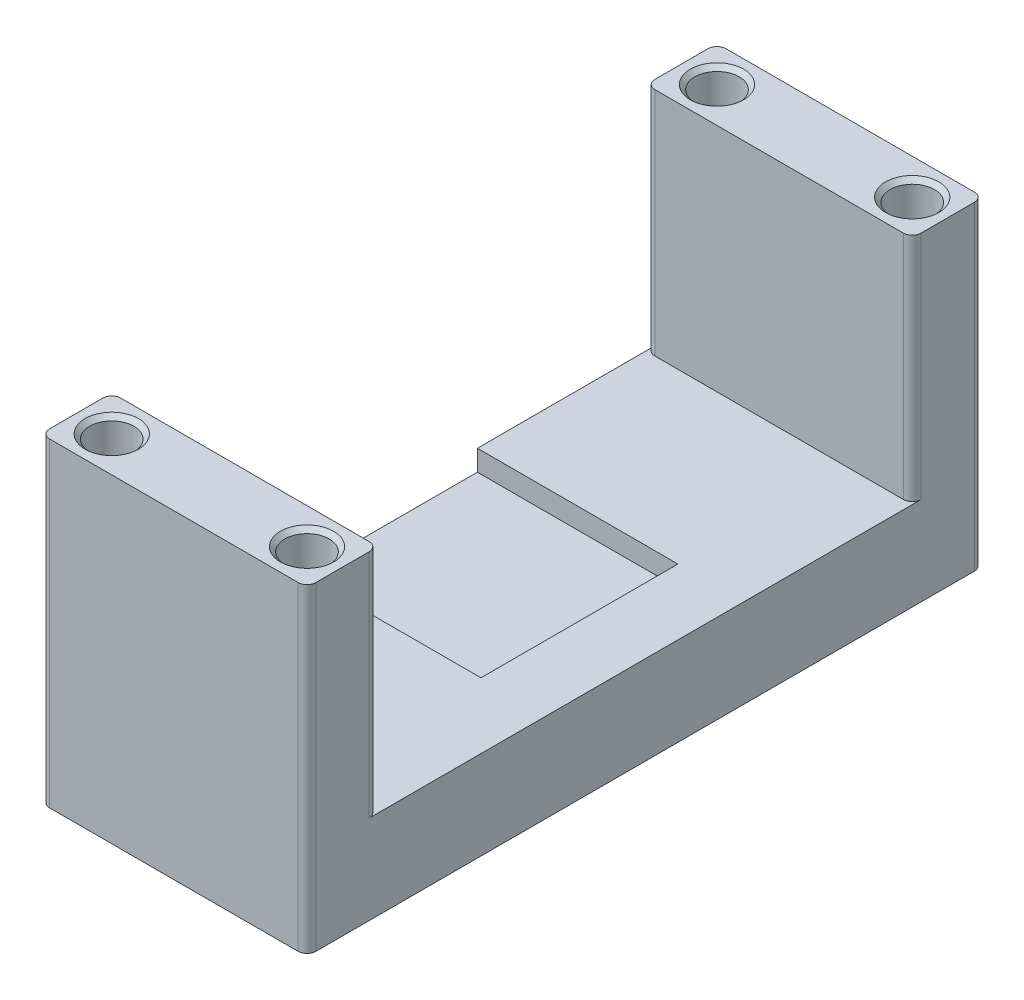
ISO-10303-21;
HEADER;
FILE_DESCRIPTION(('STEP AP214'),'2;1');
FILE_NAME('part.step','',(''),(''),'','','');
FILE_SCHEMA(('AUTOMOTIVE_DESIGN { 1 0 10303 214 1 1 1 1 }'));
ENDSEC;
DATA;
#1=APPLICATION_CONTEXT('core data for automotive mechanical design processes');
#2=APPLICATION_PROTOCOL_DEFINITION('international standard','automotive_design',2000,#1);
#3=PRODUCT_CONTEXT('',#1,'mechanical');
#4=PRODUCT('Part','Part','',(#3));
#5=PRODUCT_RELATED_PRODUCT_CATEGORY('part','',(#4));
#6=PRODUCT_DEFINITION_FORMATION('','',#4);
#7=PRODUCT_DEFINITION_CONTEXT('part definition',#1,'design');
#8=PRODUCT_DEFINITION('design','',#6,#7);
#9=PRODUCT_DEFINITION_SHAPE('','',#8);
#10=(LENGTH_UNIT() NAMED_UNIT(*) SI_UNIT(.MILLI.,.METRE.));
#11=(NAMED_UNIT(*) PLANE_ANGLE_UNIT() SI_UNIT($,.RADIAN.));
#12=(NAMED_UNIT(*) SI_UNIT($,.STERADIAN.) SOLID_ANGLE_UNIT());
#13=UNCERTAINTY_MEASURE_WITH_UNIT(LENGTH_MEASURE(1.E-05),#10,'distance_accuracy_value','');
#14=(GEOMETRIC_REPRESENTATION_CONTEXT(3) GLOBAL_UNCERTAINTY_ASSIGNED_CONTEXT((#13)) GLOBAL_UNIT_ASSIGNED_CONTEXT((#10,
#11,#12)) REPRESENTATION_CONTEXT('',''));
#15=CARTESIAN_POINT('',(0.,0.,0.));
#16=DIRECTION('',(0.,0.,1.));
#17=DIRECTION('',(1.,0.,0.));
#18=AXIS2_PLACEMENT_3D('',#15,#16,#17);
#19=CARTESIAN_POINT('',(0.,0.,0.));
#20=DIRECTION('',(0.,1.,0.));
#21=DIRECTION('',(0.,0.,1.));
#22=AXIS2_PLACEMENT_3D('',#19,#20,#21);
#23=PLANE('',#22);
#24=DIRECTION('',(0.,0.,1.));
#25=VECTOR('',#24,1.);
#26=CARTESIAN_POINT('',(-15.,0.,-38.1));
#27=LINE('',#26,#25);
#28=CARTESIAN_POINT('',(-15.,0.,11.1));
#29=VERTEX_POINT('',#28);
#30=CARTESIAN_POINT('',(-15.,0.,31.1));
#31=VERTEX_POINT('',#30);
#32=EDGE_CURVE('E196',#29,#31,#27,.T.);
#33=ORIENTED_EDGE('',*,*,#32,.T.);
#34=CARTESIAN_POINT('',(-14.,0.,31.1));
#35=DIRECTION('',(0.,1.,0.));
#36=DIRECTION('',(0.,0.,1.));
#37=AXIS2_PLACEMENT_3D('',#34,#35,#36);
#38=CIRCLE('',#37,1.);
#39=CARTESIAN_POINT('',(-14.,0.,30.1));
#40=VERTEX_POINT('',#39);
#41=EDGE_CURVE('E281',#31,#40,#38,.F.);
#42=ORIENTED_EDGE('',*,*,#41,.T.);
#43=DIRECTION('',(-1.,0.,0.));
#44=VECTOR('',#43,1.);
#45=CARTESIAN_POINT('',(-15.,0.,30.1));
#46=LINE('',#45,#44);
#47=CARTESIAN_POINT('',(14.,0.,30.1));
#48=VERTEX_POINT('',#47);
#49=EDGE_CURVE('E288',#48,#40,#46,.T.);
#50=ORIENTED_EDGE('',*,*,#49,.F.);
#51=CARTESIAN_POINT('',(14.,0.,31.1));
#52=DIRECTION('',(0.,1.,0.));
#53=DIRECTION('',(0.,0.,1.));
#54=AXIS2_PLACEMENT_3D('',#51,#52,#53);
#55=CIRCLE('',#54,1.);
#56=CARTESIAN_POINT('',(15.,0.,31.1));
#57=VERTEX_POINT('',#56);
#58=EDGE_CURVE('E283',#48,#57,#55,.F.);
#59=ORIENTED_EDGE('',*,*,#58,.T.);
#60=DIRECTION('',(0.,0.,-1.));
#61=VECTOR('',#60,1.);
#62=CARTESIAN_POINT('',(15.,0.,-38.1));
#63=LINE('',#62,#61);
#64=CARTESIAN_POINT('',(15.,0.,-31.1));
#65=VERTEX_POINT('',#64);
#66=EDGE_CURVE('E207',#57,#65,#63,.T.);
#67=ORIENTED_EDGE('',*,*,#66,.T.);
#68=CARTESIAN_POINT('',(14.,0.,-31.1));
#69=DIRECTION('',(0.,1.,0.));
#70=DIRECTION('',(0.,0.,1.));
#71=AXIS2_PLACEMENT_3D('',#68,#69,#70);
#72=CIRCLE('',#71,1.);
#73=CARTESIAN_POINT('',(14.,0.,-30.1));
#74=VERTEX_POINT('',#73);
#75=EDGE_CURVE('E41',#65,#74,#72,.F.);
#76=ORIENTED_EDGE('',*,*,#75,.T.);
#77=DIRECTION('',(1.,0.,0.));
#78=VECTOR('',#77,1.);
#79=CARTESIAN_POINT('',(-15.,0.,-30.1));
#80=LINE('',#79,#78);
#81=CARTESIAN_POINT('',(-14.,0.,-30.1));
#82=VERTEX_POINT('',#81);
#83=EDGE_CURVE('E307',#82,#74,#80,.T.);
#84=ORIENTED_EDGE('',*,*,#83,.F.);
#85=CARTESIAN_POINT('',(-14.,0.,-31.1));
#86=DIRECTION('',(0.,1.,0.));
#87=DIRECTION('',(0.,0.,1.));
#88=AXIS2_PLACEMENT_3D('',#85,#86,#87);
#89=CIRCLE('',#88,1.);
#90=CARTESIAN_POINT('',(-15.,0.,-31.1));
#91=VERTEX_POINT('',#90);
#92=EDGE_CURVE('E11',#82,#91,#89,.F.);
#93=ORIENTED_EDGE('',*,*,#92,.T.);
#94=CARTESIAN_POINT('',(-15.,0.,-11.1));
#95=VERTEX_POINT('',#94);
#96=EDGE_CURVE('E217',#91,#95,#27,.T.);
#97=ORIENTED_EDGE('',*,*,#96,.T.);
#98=DIRECTION('',(-1.,0.,0.));
#99=VECTOR('',#98,1.);
#100=CARTESIAN_POINT('',(-15.,0.,-11.1));
#101=LINE('',#100,#99);
#102=CARTESIAN_POINT('',(7.6,0.,-11.1));
#103=VERTEX_POINT('',#102);
#104=EDGE_CURVE('E190',#103,#95,#101,.T.);
#105=ORIENTED_EDGE('',*,*,#104,.F.);
#106=DIRECTION('',(0.,0.,-1.));
#107=VECTOR('',#106,1.);
#108=CARTESIAN_POINT('',(7.6,0.,-11.1));
#109=LINE('',#108,#107);
#110=CARTESIAN_POINT('',(7.6,0.,11.1));
#111=VERTEX_POINT('',#110);
#112=EDGE_CURVE('E331',#111,#103,#109,.T.);
#113=ORIENTED_EDGE('',*,*,#112,.F.);
#114=DIRECTION('',(1.,0.,0.));
#115=VECTOR('',#114,1.);
#116=CARTESIAN_POINT('',(-15.,0.,11.1));
#117=LINE('',#116,#115);
#118=EDGE_CURVE('E327',#29,#111,#117,.T.);
#119=ORIENTED_EDGE('',*,*,#118,.F.);
#120=EDGE_LOOP('',(#33,#42,#50,#59,#67,#76,#84,#93,#97,#105,#113,#119));
#121=FACE_BOUND('',#120,.T.);
#122=ADVANCED_FACE('F33',(#121),#23,.T.);
#123=CARTESIAN_POINT('',(-15.,-10.,-38.1));
#124=DIRECTION('',(-1.,0.,0.));
#125=DIRECTION('',(0.,0.,1.));
#126=AXIS2_PLACEMENT_3D('',#123,#124,#125);
#127=PLANE('',#126);
#128=DIRECTION('',(0.,0.,1.));
#129=VECTOR('',#128,1.);
#130=CARTESIAN_POINT('',(-15.,26.,38.1));
#131=LINE('',#130,#129);
#132=CARTESIAN_POINT('',(-15.,26.,31.1));
#133=VERTEX_POINT('',#132);
#134=CARTESIAN_POINT('',(-15.,26.,37.1));
#135=VERTEX_POINT('',#134);
#136=EDGE_CURVE('E309',#133,#135,#131,.T.);
#137=ORIENTED_EDGE('',*,*,#136,.F.);
#138=DIRECTION('',(0.,-1.,0.));
#139=VECTOR('',#138,1.);
#140=CARTESIAN_POINT('',(-15.,0.,31.1));
#141=LINE('',#140,#139);
#142=EDGE_CURVE('E226',#133,#31,#141,.T.);
#143=ORIENTED_EDGE('',*,*,#142,.T.);
#144=ORIENTED_EDGE('',*,*,#32,.F.);
#145=DIRECTION('',(0.,1.,0.));
#146=VECTOR('',#145,1.);
#147=CARTESIAN_POINT('',(-15.,-2.335,11.1));
#148=LINE('',#147,#146);
#149=CARTESIAN_POINT('',(-15.,-2.335,11.1));
#150=VERTEX_POINT('',#149);
#151=EDGE_CURVE('E174',#150,#29,#148,.T.);
#152=ORIENTED_EDGE('',*,*,#151,.F.);
#153=DIRECTION('',(0.,0.,1.));
#154=VECTOR('',#153,1.);
#155=CARTESIAN_POINT('',(-15.,-2.335,-11.1));
#156=LINE('',#155,#154);
#157=CARTESIAN_POINT('',(-15.,-2.335,-11.1));
#158=VERTEX_POINT('',#157);
#159=EDGE_CURVE('E181',#158,#150,#156,.T.);
#160=ORIENTED_EDGE('',*,*,#159,.F.);
#161=DIRECTION('',(0.,1.,0.));
#162=VECTOR('',#161,1.);
#163=CARTESIAN_POINT('',(-15.,-2.335,-11.1));
#164=LINE('',#163,#162);
#165=EDGE_CURVE('E336',#158,#95,#164,.T.);
#166=ORIENTED_EDGE('',*,*,#165,.T.);
#167=ORIENTED_EDGE('',*,*,#96,.F.);
#168=DIRECTION('',(0.,-1.,0.));
#169=VECTOR('',#168,1.);
#170=CARTESIAN_POINT('',(-15.,26.,-31.1));
#171=LINE('',#170,#169);
#172=CARTESIAN_POINT('',(-15.,26.,-31.1));
#173=VERTEX_POINT('',#172);
#174=EDGE_CURVE('E221',#91,#173,#171,.F.);
#175=ORIENTED_EDGE('',*,*,#174,.T.);
#176=DIRECTION('',(0.,0.,1.));
#177=VECTOR('',#176,1.);
#178=CARTESIAN_POINT('',(-15.,26.,-38.1));
#179=LINE('',#178,#177);
#180=CARTESIAN_POINT('',(-15.,26.,-37.1));
#181=VERTEX_POINT('',#180);
#182=EDGE_CURVE('E315',#181,#173,#179,.T.);
#183=ORIENTED_EDGE('',*,*,#182,.F.);
#184=DIRECTION('',(0.,1.,0.));
#185=VECTOR('',#184,1.);
#186=CARTESIAN_POINT('',(-15.,-10.,-37.1));
#187=LINE('',#186,#185);
#188=CARTESIAN_POINT('',(-15.,-10.,-37.1));
#189=VERTEX_POINT('',#188);
#190=EDGE_CURVE('E216',#181,#189,#187,.F.);
#191=ORIENTED_EDGE('',*,*,#190,.T.);
#192=DIRECTION('',(0.,0.,1.));
#193=VECTOR('',#192,1.);
#194=CARTESIAN_POINT('',(-15.,-10.,-38.1));
#195=LINE('',#194,#193);
#196=CARTESIAN_POINT('',(-15.,-10.,37.1));
#197=VERTEX_POINT('',#196);
#198=EDGE_CURVE('E203',#189,#197,#195,.T.);
#199=ORIENTED_EDGE('',*,*,#198,.T.);
#200=DIRECTION('',(0.,1.,0.));
#201=VECTOR('',#200,1.);
#202=CARTESIAN_POINT('',(-15.,-10.,37.1));
#203=LINE('',#202,#201);
#204=EDGE_CURVE('E223',#197,#135,#203,.T.);
#205=ORIENTED_EDGE('',*,*,#204,.T.);
#206=EDGE_LOOP('',(#137,#143,#144,#152,#160,#166,#167,#175,#183,#191,#199,#205));
#207=FACE_BOUND('',#206,.T.);
#208=ADVANCED_FACE('F194',(#207),#127,.T.);
#209=CARTESIAN_POINT('',(-15.,-10.,-38.1));
#210=DIRECTION('',(0.,0.,-1.));
#211=DIRECTION('',(-1.,0.,0.));
#212=AXIS2_PLACEMENT_3D('',#209,#210,#211);
#213=PLANE('',#212);
#214=DIRECTION('',(-1.,0.,0.));
#215=VECTOR('',#214,1.);
#216=CARTESIAN_POINT('',(-15.,26.,-38.1));
#217=LINE('',#216,#215);
#218=CARTESIAN_POINT('',(14.,26.,-38.1));
#219=VERTEX_POINT('',#218);
#220=CARTESIAN_POINT('',(-14.,26.,-38.1));
#221=VERTEX_POINT('',#220);
#222=EDGE_CURVE('E324',#219,#221,#217,.T.);
#223=ORIENTED_EDGE('',*,*,#222,.F.);
#224=DIRECTION('',(0.,1.,0.));
#225=VECTOR('',#224,1.);
#226=CARTESIAN_POINT('',(14.,-10.,-38.1));
#227=LINE('',#226,#225);
#228=CARTESIAN_POINT('',(14.,-10.,-38.1));
#229=VERTEX_POINT('',#228);
#230=EDGE_CURVE('E275',#219,#229,#227,.F.);
#231=ORIENTED_EDGE('',*,*,#230,.T.);
#232=DIRECTION('',(-1.,0.,0.));
#233=VECTOR('',#232,1.);
#234=CARTESIAN_POINT('',(-15.,-10.,-38.1));
#235=LINE('',#234,#233);
#236=CARTESIAN_POINT('',(-14.,-10.,-38.1));
#237=VERTEX_POINT('',#236);
#238=EDGE_CURVE('E213',#229,#237,#235,.T.);
#239=ORIENTED_EDGE('',*,*,#238,.T.);
#240=DIRECTION('',(0.,1.,0.));
#241=VECTOR('',#240,1.);
#242=CARTESIAN_POINT('',(-14.,-10.,-38.1));
#243=LINE('',#242,#241);
#244=EDGE_CURVE('E272',#237,#221,#243,.T.);
#245=ORIENTED_EDGE('',*,*,#244,.T.);
#246=EDGE_LOOP('',(#223,#231,#239,#245));
#247=FACE_BOUND('',#246,.T.);
#248=ADVANCED_FACE('F363',(#247),#213,.T.);
#249=CARTESIAN_POINT('',(15.,-10.,-38.1));
#250=DIRECTION('',(1.,0.,0.));
#251=DIRECTION('',(0.,0.,-1.));
#252=AXIS2_PLACEMENT_3D('',#249,#250,#251);
#253=PLANE('',#252);
#254=ORIENTED_EDGE('',*,*,#66,.F.);
#255=DIRECTION('',(0.,-1.,0.));
#256=VECTOR('',#255,1.);
#257=CARTESIAN_POINT('',(15.,26.,31.1));
#258=LINE('',#257,#256);
#259=CARTESIAN_POINT('',(15.,26.,31.1));
#260=VERTEX_POINT('',#259);
#261=EDGE_CURVE('E249',#57,#260,#258,.F.);
#262=ORIENTED_EDGE('',*,*,#261,.T.);
#263=DIRECTION('',(0.,0.,-1.));
#264=VECTOR('',#263,1.);
#265=CARTESIAN_POINT('',(15.,26.,38.1));
#266=LINE('',#265,#264);
#267=CARTESIAN_POINT('',(15.,26.,37.1));
#268=VERTEX_POINT('',#267);
#269=EDGE_CURVE('E297',#268,#260,#266,.T.);
#270=ORIENTED_EDGE('',*,*,#269,.F.);
#271=DIRECTION('',(0.,1.,0.));
#272=VECTOR('',#271,1.);
#273=CARTESIAN_POINT('',(15.,-10.,37.1));
#274=LINE('',#273,#272);
#275=CARTESIAN_POINT('',(15.,-10.,37.1));
#276=VERTEX_POINT('',#275);
#277=EDGE_CURVE('E247',#268,#276,#274,.F.);
#278=ORIENTED_EDGE('',*,*,#277,.T.);
#279=DIRECTION('',(0.,0.,-1.));
#280=VECTOR('',#279,1.);
#281=CARTESIAN_POINT('',(15.,-10.,-38.1));
#282=LINE('',#281,#280);
#283=CARTESIAN_POINT('',(15.,-10.,-37.1));
#284=VERTEX_POINT('',#283);
#285=EDGE_CURVE('E210',#276,#284,#282,.T.);
#286=ORIENTED_EDGE('',*,*,#285,.T.);
#287=DIRECTION('',(0.,1.,0.));
#288=VECTOR('',#287,1.);
#289=CARTESIAN_POINT('',(15.,-10.,-37.1));
#290=LINE('',#289,#288);
#291=CARTESIAN_POINT('',(15.,26.,-37.1));
#292=VERTEX_POINT('',#291);
#293=EDGE_CURVE('E244',#284,#292,#290,.T.);
#294=ORIENTED_EDGE('',*,*,#293,.T.);
#295=DIRECTION('',(0.,0.,-1.));
#296=VECTOR('',#295,1.);
#297=CARTESIAN_POINT('',(15.,26.,-38.1));
#298=LINE('',#297,#296);
#299=CARTESIAN_POINT('',(15.,26.,-31.1));
#300=VERTEX_POINT('',#299);
#301=EDGE_CURVE('E321',#300,#292,#298,.T.);
#302=ORIENTED_EDGE('',*,*,#301,.F.);
#303=DIRECTION('',(0.,-1.,0.));
#304=VECTOR('',#303,1.);
#305=CARTESIAN_POINT('',(15.,0.,-31.1));
#306=LINE('',#305,#304);
#307=EDGE_CURVE('E241',#300,#65,#306,.T.);
#308=ORIENTED_EDGE('',*,*,#307,.T.);
#309=EDGE_LOOP('',(#254,#262,#270,#278,#286,#294,#302,#308));
#310=FACE_BOUND('',#309,.T.);
#311=ADVANCED_FACE('F296',(#310),#253,.T.);
#312=CARTESIAN_POINT('',(-15.,-10.,38.1));
#313=DIRECTION('',(0.,0.,1.));
#314=DIRECTION('',(1.,0.,0.));
#315=AXIS2_PLACEMENT_3D('',#312,#313,#314);
#316=PLANE('',#315);
#317=DIRECTION('',(1.,0.,0.));
#318=VECTOR('',#317,1.);
#319=CARTESIAN_POINT('',(-15.,-10.,38.1));
#320=LINE('',#319,#318);
#321=CARTESIAN_POINT('',(-14.,-10.,38.1));
#322=VERTEX_POINT('',#321);
#323=CARTESIAN_POINT('',(14.,-10.,38.1));
#324=VERTEX_POINT('',#323);
#325=EDGE_CURVE('E206',#322,#324,#320,.T.);
#326=ORIENTED_EDGE('',*,*,#325,.T.);
#327=DIRECTION('',(0.,1.,0.));
#328=VECTOR('',#327,1.);
#329=CARTESIAN_POINT('',(14.,-10.,38.1));
#330=LINE('',#329,#328);
#331=CARTESIAN_POINT('',(14.,26.,38.1));
#332=VERTEX_POINT('',#331);
#333=EDGE_CURVE('E253',#324,#332,#330,.T.);
#334=ORIENTED_EDGE('',*,*,#333,.T.);
#335=DIRECTION('',(1.,0.,0.));
#336=VECTOR('',#335,1.);
#337=CARTESIAN_POINT('',(-15.,26.,38.1));
#338=LINE('',#337,#336);
#339=CARTESIAN_POINT('',(-14.,26.,38.1));
#340=VERTEX_POINT('',#339);
#341=EDGE_CURVE('E305',#340,#332,#338,.T.);
#342=ORIENTED_EDGE('',*,*,#341,.F.);
#343=DIRECTION('',(0.,1.,0.));
#344=VECTOR('',#343,1.);
#345=CARTESIAN_POINT('',(-14.,-10.,38.1));
#346=LINE('',#345,#344);
#347=EDGE_CURVE('E251',#340,#322,#346,.F.);
#348=ORIENTED_EDGE('',*,*,#347,.T.);
#349=EDGE_LOOP('',(#326,#334,#342,#348));
#350=FACE_BOUND('',#349,.T.);
#351=ADVANCED_FACE('F378',(#350),#316,.T.);
#352=CARTESIAN_POINT('',(0.,-10.,0.));
#353=DIRECTION('',(0.,1.,0.));
#354=DIRECTION('',(0.,0.,1.));
#355=AXIS2_PLACEMENT_3D('',#352,#353,#354);
#356=PLANE('',#355);
#357=ORIENTED_EDGE('',*,*,#285,.F.);
#358=CARTESIAN_POINT('',(14.,-10.,37.1));
#359=DIRECTION('',(0.,1.,0.));
#360=DIRECTION('',(0.,0.,1.));
#361=AXIS2_PLACEMENT_3D('',#358,#359,#360);
#362=CIRCLE('',#361,1.);
#363=EDGE_CURVE('E262',#276,#324,#362,.F.);
#364=ORIENTED_EDGE('',*,*,#363,.T.);
#365=ORIENTED_EDGE('',*,*,#325,.F.);
#366=CARTESIAN_POINT('',(-14.,-10.,37.1));
#367=DIRECTION('',(0.,1.,0.));
#368=DIRECTION('',(0.,0.,1.));
#369=AXIS2_PLACEMENT_3D('',#366,#367,#368);
#370=CIRCLE('',#369,1.);
#371=EDGE_CURVE('E260',#322,#197,#370,.F.);
#372=ORIENTED_EDGE('',*,*,#371,.T.);
#373=ORIENTED_EDGE('',*,*,#198,.F.);
#374=CARTESIAN_POINT('',(-14.,-10.,-37.1));
#375=DIRECTION('',(0.,1.,0.));
#376=DIRECTION('',(0.,0.,1.));
#377=AXIS2_PLACEMENT_3D('',#374,#375,#376);
#378=CIRCLE('',#377,1.);
#379=EDGE_CURVE('E256',#189,#237,#378,.F.);
#380=ORIENTED_EDGE('',*,*,#379,.T.);
#381=ORIENTED_EDGE('',*,*,#238,.F.);
#382=CARTESIAN_POINT('',(14.,-10.,-37.1));
#383=DIRECTION('',(0.,1.,0.));
#384=DIRECTION('',(0.,0.,1.));
#385=AXIS2_PLACEMENT_3D('',#382,#383,#384);
#386=CIRCLE('',#385,1.);
#387=EDGE_CURVE('E258',#229,#284,#386,.F.);
#388=ORIENTED_EDGE('',*,*,#387,.T.);
#389=EDGE_LOOP('',(#357,#364,#365,#372,#373,#380,#381,#388));
#390=FACE_BOUND('',#389,.T.);
#391=ADVANCED_FACE('F370',(#390),#356,.F.);
#392=CARTESIAN_POINT('',(-15.,-2.335,-11.1));
#393=DIRECTION('',(0.,0.,-1.));
#394=DIRECTION('',(-1.,0.,0.));
#395=AXIS2_PLACEMENT_3D('',#392,#393,#394);
#396=PLANE('',#395);
#397=ORIENTED_EDGE('',*,*,#104,.T.);
#398=ORIENTED_EDGE('',*,*,#165,.F.);
#399=DIRECTION('',(-1.,0.,0.));
#400=VECTOR('',#399,1.);
#401=CARTESIAN_POINT('',(-15.,-2.335,-11.1));
#402=LINE('',#401,#400);
#403=CARTESIAN_POINT('',(7.6,-2.335,-11.1));
#404=VERTEX_POINT('',#403);
#405=EDGE_CURVE('E187',#404,#158,#402,.T.);
#406=ORIENTED_EDGE('',*,*,#405,.F.);
#407=DIRECTION('',(0.,1.,0.));
#408=VECTOR('',#407,1.);
#409=CARTESIAN_POINT('',(7.6,-2.335,-11.1));
#410=LINE('',#409,#408);
#411=EDGE_CURVE('E198',#404,#103,#410,.T.);
#412=ORIENTED_EDGE('',*,*,#411,.T.);
#413=EDGE_LOOP('',(#397,#398,#406,#412));
#414=FACE_BOUND('',#413,.T.);
#415=ADVANCED_FACE('F338',(#414),#396,.F.);
#416=CARTESIAN_POINT('',(7.6,-2.335,-11.1));
#417=DIRECTION('',(1.,0.,0.));
#418=DIRECTION('',(0.,0.,-1.));
#419=AXIS2_PLACEMENT_3D('',#416,#417,#418);
#420=PLANE('',#419);
#421=ORIENTED_EDGE('',*,*,#112,.T.);
#422=ORIENTED_EDGE('',*,*,#411,.F.);
#423=DIRECTION('',(0.,0.,-1.));
#424=VECTOR('',#423,1.);
#425=CARTESIAN_POINT('',(7.6,-2.335,-11.1));
#426=LINE('',#425,#424);
#427=CARTESIAN_POINT('',(7.6,-2.335,11.1));
#428=VERTEX_POINT('',#427);
#429=EDGE_CURVE('E180',#428,#404,#426,.T.);
#430=ORIENTED_EDGE('',*,*,#429,.F.);
#431=DIRECTION('',(0.,1.,0.));
#432=VECTOR('',#431,1.);
#433=CARTESIAN_POINT('',(7.6,-2.335,11.1));
#434=LINE('',#433,#432);
#435=EDGE_CURVE('E176',#428,#111,#434,.T.);
#436=ORIENTED_EDGE('',*,*,#435,.T.);
#437=EDGE_LOOP('',(#421,#422,#430,#436));
#438=FACE_BOUND('',#437,.T.);
#439=ADVANCED_FACE('F342',(#438),#420,.F.);
#440=CARTESIAN_POINT('',(-15.,-2.335,11.1));
#441=DIRECTION('',(0.,0.,1.));
#442=DIRECTION('',(1.,0.,0.));
#443=AXIS2_PLACEMENT_3D('',#440,#441,#442);
#444=PLANE('',#443);
#445=ORIENTED_EDGE('',*,*,#118,.T.);
#446=ORIENTED_EDGE('',*,*,#435,.F.);
#447=DIRECTION('',(1.,0.,0.));
#448=VECTOR('',#447,1.);
#449=CARTESIAN_POINT('',(-15.,-2.335,11.1));
#450=LINE('',#449,#448);
#451=EDGE_CURVE('E169',#150,#428,#450,.T.);
#452=ORIENTED_EDGE('',*,*,#451,.F.);
#453=ORIENTED_EDGE('',*,*,#151,.T.);
#454=EDGE_LOOP('',(#445,#446,#452,#453));
#455=FACE_BOUND('',#454,.T.);
#456=ADVANCED_FACE('F172',(#455),#444,.F.);
#457=CARTESIAN_POINT('',(0.,-2.335,0.));
#458=DIRECTION('',(0.,1.,0.));
#459=DIRECTION('',(0.,0.,1.));
#460=AXIS2_PLACEMENT_3D('',#457,#458,#459);
#461=PLANE('',#460);
#462=ORIENTED_EDGE('',*,*,#159,.T.);
#463=ORIENTED_EDGE('',*,*,#451,.T.);
#464=ORIENTED_EDGE('',*,*,#429,.T.);
#465=ORIENTED_EDGE('',*,*,#405,.T.);
#466=EDGE_LOOP('',(#462,#463,#464,#465));
#467=FACE_BOUND('',#466,.T.);
#468=ADVANCED_FACE('F185',(#467),#461,.T.);
#469=CARTESIAN_POINT('',(-15.,26.,-30.1));
#470=DIRECTION('',(0.,0.,-1.));
#471=DIRECTION('',(-1.,0.,0.));
#472=AXIS2_PLACEMENT_3D('',#469,#470,#471);
#473=PLANE('',#472);
#474=ORIENTED_EDGE('',*,*,#83,.T.);
#475=DIRECTION('',(0.,-1.,0.));
#476=VECTOR('',#475,1.);
#477=CARTESIAN_POINT('',(14.,26.,-30.1));
#478=LINE('',#477,#476);
#479=CARTESIAN_POINT('',(14.,26.,-30.1));
#480=VERTEX_POINT('',#479);
#481=EDGE_CURVE('E279',#74,#480,#478,.F.);
#482=ORIENTED_EDGE('',*,*,#481,.T.);
#483=DIRECTION('',(1.,0.,0.));
#484=VECTOR('',#483,1.);
#485=CARTESIAN_POINT('',(-15.,26.,-30.1));
#486=LINE('',#485,#484);
#487=CARTESIAN_POINT('',(-14.,26.,-30.1));
#488=VERTEX_POINT('',#487);
#489=EDGE_CURVE('E318',#488,#480,#486,.T.);
#490=ORIENTED_EDGE('',*,*,#489,.F.);
#491=DIRECTION('',(0.,-1.,0.));
#492=VECTOR('',#491,1.);
#493=CARTESIAN_POINT('',(-14.,0.,-30.1));
#494=LINE('',#493,#492);
#495=EDGE_CURVE('E277',#488,#82,#494,.T.);
#496=ORIENTED_EDGE('',*,*,#495,.T.);
#497=EDGE_LOOP('',(#474,#482,#490,#496));
#498=FACE_BOUND('',#497,.T.);
#499=ADVANCED_FACE('F351',(#498),#473,.F.);
#500=CARTESIAN_POINT('',(0.,26.,0.));
#501=DIRECTION('',(0.,1.,0.));
#502=DIRECTION('',(0.,0.,1.));
#503=AXIS2_PLACEMENT_3D('',#500,#501,#502);
#504=PLANE('',#503);
#505=CARTESIAN_POINT('',(-11.,26.,-34.1));
#506=DIRECTION('',(0.,1.,0.));
#507=DIRECTION('',(0.,0.,1.));
#508=AXIS2_PLACEMENT_3D('',#505,#506,#507);
#509=CIRCLE('',#508,3.);
#510=CARTESIAN_POINT('',(-11.,26.,-31.1));
#511=VERTEX_POINT('',#510);
#512=EDGE_CURVE('E709',#511,#511,#509,.T.);
#513=ORIENTED_EDGE('',*,*,#512,.F.);
#514=EDGE_LOOP('',(#513));
#515=FACE_BOUND('',#514,.T.);
#516=CARTESIAN_POINT('',(11.,26.,-34.1));
#517=DIRECTION('',(0.,1.,0.));
#518=DIRECTION('',(0.,0.,1.));
#519=AXIS2_PLACEMENT_3D('',#516,#517,#518);
#520=CIRCLE('',#519,3.);
#521=CARTESIAN_POINT('',(11.,26.,-31.1));
#522=VERTEX_POINT('',#521);
#523=EDGE_CURVE('E712',#522,#522,#520,.T.);
#524=ORIENTED_EDGE('',*,*,#523,.F.);
#525=EDGE_LOOP('',(#524));
#526=FACE_BOUND('',#525,.T.);
#527=ORIENTED_EDGE('',*,*,#301,.T.);
#528=CARTESIAN_POINT('',(14.,26.,-37.1));
#529=DIRECTION('',(0.,1.,0.));
#530=DIRECTION('',(0.,0.,1.));
#531=AXIS2_PLACEMENT_3D('',#528,#529,#530);
#532=CIRCLE('',#531,1.);
#533=EDGE_CURVE('E270',#292,#219,#532,.T.);
#534=ORIENTED_EDGE('',*,*,#533,.T.);
#535=ORIENTED_EDGE('',*,*,#222,.T.);
#536=CARTESIAN_POINT('',(-14.,26.,-37.1));
#537=DIRECTION('',(0.,1.,0.));
#538=DIRECTION('',(0.,0.,1.));
#539=AXIS2_PLACEMENT_3D('',#536,#537,#538);
#540=CIRCLE('',#539,1.);
#541=EDGE_CURVE('E264',#221,#181,#540,.T.);
#542=ORIENTED_EDGE('',*,*,#541,.T.);
#543=ORIENTED_EDGE('',*,*,#182,.T.);
#544=CARTESIAN_POINT('',(-14.,26.,-31.1));
#545=DIRECTION('',(0.,1.,0.));
#546=DIRECTION('',(0.,0.,1.));
#547=AXIS2_PLACEMENT_3D('',#544,#545,#546);
#548=CIRCLE('',#547,1.);
#549=EDGE_CURVE('E266',#173,#488,#548,.T.);
#550=ORIENTED_EDGE('',*,*,#549,.T.);
#551=ORIENTED_EDGE('',*,*,#489,.T.);
#552=CARTESIAN_POINT('',(14.,26.,-31.1));
#553=DIRECTION('',(0.,1.,0.));
#554=DIRECTION('',(0.,0.,1.));
#555=AXIS2_PLACEMENT_3D('',#552,#553,#554);
#556=CIRCLE('',#555,1.);
#557=EDGE_CURVE('E268',#480,#300,#556,.T.);
#558=ORIENTED_EDGE('',*,*,#557,.T.);
#559=EDGE_LOOP('',(#527,#534,#535,#542,#543,#550,#551,#558));
#560=FACE_BOUND('',#559,.T.);
#561=ADVANCED_FACE('F347',(#515,#526,#560),#504,.T.);
#562=CARTESIAN_POINT('',(-15.,26.,30.1));
#563=DIRECTION('',(0.,0.,1.));
#564=DIRECTION('',(1.,0.,0.));
#565=AXIS2_PLACEMENT_3D('',#562,#563,#564);
#566=PLANE('',#565);
#567=ORIENTED_EDGE('',*,*,#49,.T.);
#568=DIRECTION('',(0.,-1.,0.));
#569=VECTOR('',#568,1.);
#570=CARTESIAN_POINT('',(-14.,26.,30.1));
#571=LINE('',#570,#569);
#572=CARTESIAN_POINT('',(-14.,26.,30.1));
#573=VERTEX_POINT('',#572);
#574=EDGE_CURVE('E231',#40,#573,#571,.F.);
#575=ORIENTED_EDGE('',*,*,#574,.T.);
#576=DIRECTION('',(-1.,0.,0.));
#577=VECTOR('',#576,1.);
#578=CARTESIAN_POINT('',(-15.,26.,30.1));
#579=LINE('',#578,#577);
#580=CARTESIAN_POINT('',(14.,26.,30.1));
#581=VERTEX_POINT('',#580);
#582=EDGE_CURVE('E304',#581,#573,#579,.T.);
#583=ORIENTED_EDGE('',*,*,#582,.F.);
#584=DIRECTION('',(0.,-1.,0.));
#585=VECTOR('',#584,1.);
#586=CARTESIAN_POINT('',(14.,0.,30.1));
#587=LINE('',#586,#585);
#588=EDGE_CURVE('E228',#581,#48,#587,.T.);
#589=ORIENTED_EDGE('',*,*,#588,.T.);
#590=EDGE_LOOP('',(#567,#575,#583,#589));
#591=FACE_BOUND('',#590,.T.);
#592=ADVANCED_FACE('F577',(#591),#566,.F.);
#593=CARTESIAN_POINT('',(0.,26.,0.));
#594=DIRECTION('',(0.,-1.,0.));
#595=DIRECTION('',(0.,0.,-1.));
#596=AXIS2_PLACEMENT_3D('',#593,#594,#595);
#597=PLANE('',#596);
#598=CARTESIAN_POINT('',(11.,26.,34.1));
#599=DIRECTION('',(0.,1.,0.));
#600=DIRECTION('',(0.,0.,1.));
#601=AXIS2_PLACEMENT_3D('',#598,#599,#600);
#602=CIRCLE('',#601,3.);
#603=CARTESIAN_POINT('',(11.,26.,37.1));
#604=VERTEX_POINT('',#603);
#605=EDGE_CURVE('E727',#604,#604,#602,.T.);
#606=ORIENTED_EDGE('',*,*,#605,.F.);
#607=EDGE_LOOP('',(#606));
#608=FACE_BOUND('',#607,.T.);
#609=CARTESIAN_POINT('',(-11.,26.,34.1));
#610=DIRECTION('',(0.,1.,0.));
#611=DIRECTION('',(0.,0.,1.));
#612=AXIS2_PLACEMENT_3D('',#609,#610,#611);
#613=CIRCLE('',#612,3.);
#614=CARTESIAN_POINT('',(-11.,26.,37.1));
#615=VERTEX_POINT('',#614);
#616=EDGE_CURVE('E736',#615,#615,#613,.T.);
#617=ORIENTED_EDGE('',*,*,#616,.F.);
#618=EDGE_LOOP('',(#617));
#619=FACE_BOUND('',#618,.T.);
#620=ORIENTED_EDGE('',*,*,#582,.T.);
#621=CARTESIAN_POINT('',(-14.,26.,31.1));
#622=DIRECTION('',(0.,-1.,0.));
#623=DIRECTION('',(0.,0.,-1.));
#624=AXIS2_PLACEMENT_3D('',#621,#622,#623);
#625=CIRCLE('',#624,1.);
#626=EDGE_CURVE('E239',#573,#133,#625,.F.);
#627=ORIENTED_EDGE('',*,*,#626,.T.);
#628=ORIENTED_EDGE('',*,*,#136,.T.);
#629=CARTESIAN_POINT('',(-14.,26.,37.1));
#630=DIRECTION('',(0.,-1.,0.));
#631=DIRECTION('',(0.,0.,-1.));
#632=AXIS2_PLACEMENT_3D('',#629,#630,#631);
#633=CIRCLE('',#632,1.);
#634=EDGE_CURVE('E233',#135,#340,#633,.F.);
#635=ORIENTED_EDGE('',*,*,#634,.T.);
#636=ORIENTED_EDGE('',*,*,#341,.T.);
#637=CARTESIAN_POINT('',(14.,26.,37.1));
#638=DIRECTION('',(0.,-1.,0.));
#639=DIRECTION('',(0.,0.,-1.));
#640=AXIS2_PLACEMENT_3D('',#637,#638,#639);
#641=CIRCLE('',#640,1.);
#642=EDGE_CURVE('E235',#332,#268,#641,.F.);
#643=ORIENTED_EDGE('',*,*,#642,.T.);
#644=ORIENTED_EDGE('',*,*,#269,.T.);
#645=CARTESIAN_POINT('',(14.,26.,31.1));
#646=DIRECTION('',(0.,-1.,0.));
#647=DIRECTION('',(0.,0.,-1.));
#648=AXIS2_PLACEMENT_3D('',#645,#646,#647);
#649=CIRCLE('',#648,1.);
#650=EDGE_CURVE('E237',#260,#581,#649,.F.);
#651=ORIENTED_EDGE('',*,*,#650,.T.);
#652=EDGE_LOOP('',(#620,#627,#628,#635,#636,#643,#644,#651));
#653=FACE_BOUND('',#652,.T.);
#654=ADVANCED_FACE('F301',(#608,#619,#653),#597,.F.);
#655=CARTESIAN_POINT('',(-11.,21.4,34.1));
#656=DIRECTION('',(0.,-1.,0.));
#657=DIRECTION('',(0.,0.,-1.));
#658=AXIS2_PLACEMENT_3D('',#655,#656,#657);
#659=PLANE('',#658);
#660=CARTESIAN_POINT('',(-11.,21.4,34.1));
#661=DIRECTION('',(0.,1.,0.));
#662=DIRECTION('',(0.,0.,1.));
#663=AXIS2_PLACEMENT_3D('',#660,#661,#662);
#664=CIRCLE('',#663,2.49999999999999);
#665=CARTESIAN_POINT('',(-11.,21.4,36.6));
#666=VERTEX_POINT('',#665);
#667=EDGE_CURVE('E314',#666,#666,#664,.T.);
#668=ORIENTED_EDGE('',*,*,#667,.T.);
#669=EDGE_LOOP('',(#668));
#670=FACE_BOUND('',#669,.T.);
#671=ADVANCED_FACE('F560',(#670),#659,.F.);
#672=CARTESIAN_POINT('',(-11.,26.,34.1));
#673=DIRECTION('',(0.,1.,0.));
#674=DIRECTION('',(0.,0.,1.));
#675=AXIS2_PLACEMENT_3D('',#672,#673,#674);
#676=CYLINDRICAL_SURFACE('',#675,2.49999999999999);
#677=ORIENTED_EDGE('',*,*,#667,.F.);
#678=EDGE_LOOP('',(#677));
#679=FACE_BOUND('',#678,.T.);
#680=CARTESIAN_POINT('',(-11.,25.5,34.1));
#681=DIRECTION('',(0.,1.,0.));
#682=DIRECTION('',(0.,0.,1.));
#683=AXIS2_PLACEMENT_3D('',#680,#681,#682);
#684=CIRCLE('',#683,2.5);
#685=CARTESIAN_POINT('',(-11.,25.5,36.6));
#686=VERTEX_POINT('',#685);
#687=EDGE_CURVE('E739',#686,#686,#684,.T.);
#688=ORIENTED_EDGE('',*,*,#687,.T.);
#689=EDGE_LOOP('',(#688));
#690=FACE_BOUND('',#689,.T.);
#691=ADVANCED_FACE('F551',(#679,#690),#676,.F.);
#692=CARTESIAN_POINT('',(-11.,26.,34.1));
#693=DIRECTION('',(0.,1.,0.));
#694=DIRECTION('',(0.,0.,1.));
#695=AXIS2_PLACEMENT_3D('',#692,#693,#694);
#696=CONICAL_SURFACE('',#695,3.,0.785398163397448);
#697=ORIENTED_EDGE('',*,*,#687,.F.);
#698=EDGE_LOOP('',(#697));
#699=FACE_BOUND('',#698,.T.);
#700=ORIENTED_EDGE('',*,*,#616,.T.);
#701=EDGE_LOOP('',(#700));
#702=FACE_BOUND('',#701,.T.);
#703=ADVANCED_FACE('F542',(#699,#702),#696,.F.);
#704=CARTESIAN_POINT('',(11.,21.4,34.1));
#705=DIRECTION('',(0.,-1.,0.));
#706=DIRECTION('',(0.,0.,-1.));
#707=AXIS2_PLACEMENT_3D('',#704,#705,#706);
#708=PLANE('',#707);
#709=CARTESIAN_POINT('',(11.,21.4,34.1));
#710=DIRECTION('',(0.,1.,0.));
#711=DIRECTION('',(0.,0.,1.));
#712=AXIS2_PLACEMENT_3D('',#709,#710,#711);
#713=CIRCLE('',#712,2.49999999999999);
#714=CARTESIAN_POINT('',(11.,21.4,36.6));
#715=VERTEX_POINT('',#714);
#716=EDGE_CURVE('E733',#715,#715,#713,.T.);
#717=ORIENTED_EDGE('',*,*,#716,.T.);
#718=EDGE_LOOP('',(#717));
#719=FACE_BOUND('',#718,.T.);
#720=ADVANCED_FACE('F533',(#719),#708,.F.);
#721=CARTESIAN_POINT('',(11.,26.,34.1));
#722=DIRECTION('',(0.,1.,0.));
#723=DIRECTION('',(0.,0.,1.));
#724=AXIS2_PLACEMENT_3D('',#721,#722,#723);
#725=CYLINDRICAL_SURFACE('',#724,2.49999999999999);
#726=ORIENTED_EDGE('',*,*,#716,.F.);
#727=EDGE_LOOP('',(#726));
#728=FACE_BOUND('',#727,.T.);
#729=CARTESIAN_POINT('',(11.,25.5,34.1));
#730=DIRECTION('',(0.,1.,0.));
#731=DIRECTION('',(0.,0.,1.));
#732=AXIS2_PLACEMENT_3D('',#729,#730,#731);
#733=CIRCLE('',#732,2.5);
#734=CARTESIAN_POINT('',(11.,25.5,36.6));
#735=VERTEX_POINT('',#734);
#736=EDGE_CURVE('E730',#735,#735,#733,.T.);
#737=ORIENTED_EDGE('',*,*,#736,.T.);
#738=EDGE_LOOP('',(#737));
#739=FACE_BOUND('',#738,.T.);
#740=ADVANCED_FACE('F524',(#728,#739),#725,.F.);
#741=CARTESIAN_POINT('',(11.,26.,34.1));
#742=DIRECTION('',(0.,1.,0.));
#743=DIRECTION('',(0.,0.,1.));
#744=AXIS2_PLACEMENT_3D('',#741,#742,#743);
#745=CONICAL_SURFACE('',#744,3.,0.785398163397448);
#746=ORIENTED_EDGE('',*,*,#736,.F.);
#747=EDGE_LOOP('',(#746));
#748=FACE_BOUND('',#747,.T.);
#749=ORIENTED_EDGE('',*,*,#605,.T.);
#750=EDGE_LOOP('',(#749));
#751=FACE_BOUND('',#750,.T.);
#752=ADVANCED_FACE('F515',(#748,#751),#745,.F.);
#753=CARTESIAN_POINT('',(11.,21.4,-34.1));
#754=DIRECTION('',(0.,-1.,0.));
#755=DIRECTION('',(0.,0.,-1.));
#756=AXIS2_PLACEMENT_3D('',#753,#754,#755);
#757=PLANE('',#756);
#758=CARTESIAN_POINT('',(11.,21.4,-34.1));
#759=DIRECTION('',(0.,1.,0.));
#760=DIRECTION('',(0.,0.,1.));
#761=AXIS2_PLACEMENT_3D('',#758,#759,#760);
#762=CIRCLE('',#761,2.49999999999999);
#763=CARTESIAN_POINT('',(11.,21.4,-31.6));
#764=VERTEX_POINT('',#763);
#765=EDGE_CURVE('E718',#764,#764,#762,.T.);
#766=ORIENTED_EDGE('',*,*,#765,.T.);
#767=EDGE_LOOP('',(#766));
#768=FACE_BOUND('',#767,.T.);
#769=ADVANCED_FACE('F506',(#768),#757,.F.);
#770=CARTESIAN_POINT('',(11.,26.,-34.1));
#771=DIRECTION('',(0.,1.,0.));
#772=DIRECTION('',(0.,0.,1.));
#773=AXIS2_PLACEMENT_3D('',#770,#771,#772);
#774=CYLINDRICAL_SURFACE('',#773,2.49999999999999);
#775=ORIENTED_EDGE('',*,*,#765,.F.);
#776=EDGE_LOOP('',(#775));
#777=FACE_BOUND('',#776,.T.);
#778=CARTESIAN_POINT('',(11.,25.5,-34.1));
#779=DIRECTION('',(0.,1.,0.));
#780=DIRECTION('',(0.,0.,1.));
#781=AXIS2_PLACEMENT_3D('',#778,#779,#780);
#782=CIRCLE('',#781,2.5);
#783=CARTESIAN_POINT('',(11.,25.5,-31.6));
#784=VERTEX_POINT('',#783);
#785=EDGE_CURVE('E714',#784,#784,#782,.T.);
#786=ORIENTED_EDGE('',*,*,#785,.T.);
#787=EDGE_LOOP('',(#786));
#788=FACE_BOUND('',#787,.T.);
#789=ADVANCED_FACE('F497',(#777,#788),#774,.F.);
#790=CARTESIAN_POINT('',(11.,26.,-34.1));
#791=DIRECTION('',(0.,1.,0.));
#792=DIRECTION('',(0.,0.,1.));
#793=AXIS2_PLACEMENT_3D('',#790,#791,#792);
#794=CONICAL_SURFACE('',#793,3.,0.785398163397448);
#795=ORIENTED_EDGE('',*,*,#785,.F.);
#796=EDGE_LOOP('',(#795));
#797=FACE_BOUND('',#796,.T.);
#798=ORIENTED_EDGE('',*,*,#523,.T.);
#799=EDGE_LOOP('',(#798));
#800=FACE_BOUND('',#799,.T.);
#801=ADVANCED_FACE('F488',(#797,#800),#794,.F.);
#802=CARTESIAN_POINT('',(-11.,21.4,-34.1));
#803=DIRECTION('',(0.,-1.,0.));
#804=DIRECTION('',(0.,0.,-1.));
#805=AXIS2_PLACEMENT_3D('',#802,#803,#804);
#806=PLANE('',#805);
#807=CARTESIAN_POINT('',(-11.,21.4,-34.1));
#808=DIRECTION('',(0.,1.,0.));
#809=DIRECTION('',(0.,0.,1.));
#810=AXIS2_PLACEMENT_3D('',#807,#808,#809);
#811=CIRCLE('',#810,2.49999999999999);
#812=CARTESIAN_POINT('',(-11.,21.4,-31.6));
#813=VERTEX_POINT('',#812);
#814=EDGE_CURVE('E715',#813,#813,#811,.T.);
#815=ORIENTED_EDGE('',*,*,#814,.T.);
#816=EDGE_LOOP('',(#815));
#817=FACE_BOUND('',#816,.T.);
#818=ADVANCED_FACE('F479',(#817),#806,.F.);
#819=CARTESIAN_POINT('',(-11.,26.,-34.1));
#820=DIRECTION('',(0.,1.,0.));
#821=DIRECTION('',(0.,0.,1.));
#822=AXIS2_PLACEMENT_3D('',#819,#820,#821);
#823=CYLINDRICAL_SURFACE('',#822,2.49999999999999);
#824=ORIENTED_EDGE('',*,*,#814,.F.);
#825=EDGE_LOOP('',(#824));
#826=FACE_BOUND('',#825,.T.);
#827=CARTESIAN_POINT('',(-11.,25.5,-34.1));
#828=DIRECTION('',(0.,1.,0.));
#829=DIRECTION('',(0.,0.,1.));
#830=AXIS2_PLACEMENT_3D('',#827,#828,#829);
#831=CIRCLE('',#830,2.5);
#832=CARTESIAN_POINT('',(-11.,25.5,-31.6));
#833=VERTEX_POINT('',#832);
#834=EDGE_CURVE('E721',#833,#833,#831,.T.);
#835=ORIENTED_EDGE('',*,*,#834,.T.);
#836=EDGE_LOOP('',(#835));
#837=FACE_BOUND('',#836,.T.);
#838=ADVANCED_FACE('F470',(#826,#837),#823,.F.);
#839=CARTESIAN_POINT('',(-11.,26.,-34.1));
#840=DIRECTION('',(0.,1.,0.));
#841=DIRECTION('',(0.,0.,1.));
#842=AXIS2_PLACEMENT_3D('',#839,#840,#841);
#843=CONICAL_SURFACE('',#842,3.,0.785398163397448);
#844=ORIENTED_EDGE('',*,*,#834,.F.);
#845=EDGE_LOOP('',(#844));
#846=FACE_BOUND('',#845,.T.);
#847=ORIENTED_EDGE('',*,*,#512,.T.);
#848=EDGE_LOOP('',(#847));
#849=FACE_BOUND('',#848,.T.);
#850=ADVANCED_FACE('F410',(#846,#849),#843,.F.);
#851=CARTESIAN_POINT('',(-14.,-10.,31.1));
#852=DIRECTION('',(0.,1.,0.));
#853=DIRECTION('',(0.,0.,1.));
#854=AXIS2_PLACEMENT_3D('',#851,#852,#853);
#855=CYLINDRICAL_SURFACE('',#854,1.);
#856=ORIENTED_EDGE('',*,*,#626,.F.);
#857=ORIENTED_EDGE('',*,*,#574,.F.);
#858=ORIENTED_EDGE('',*,*,#41,.F.);
#859=ORIENTED_EDGE('',*,*,#142,.F.);
#860=EDGE_LOOP('',(#856,#857,#858,#859));
#861=FACE_BOUND('',#860,.T.);
#862=ADVANCED_FACE('F407',(#861),#855,.T.);
#863=CARTESIAN_POINT('',(14.,26.,31.1));
#864=DIRECTION('',(0.,1.,0.));
#865=DIRECTION('',(0.,0.,1.));
#866=AXIS2_PLACEMENT_3D('',#863,#864,#865);
#867=CYLINDRICAL_SURFACE('',#866,1.);
#868=ORIENTED_EDGE('',*,*,#650,.F.);
#869=ORIENTED_EDGE('',*,*,#261,.F.);
#870=ORIENTED_EDGE('',*,*,#58,.F.);
#871=ORIENTED_EDGE('',*,*,#588,.F.);
#872=EDGE_LOOP('',(#868,#869,#870,#871));
#873=FACE_BOUND('',#872,.T.);
#874=ADVANCED_FACE('F292',(#873),#867,.T.);
#875=CARTESIAN_POINT('',(14.,-10.,37.1));
#876=DIRECTION('',(0.,1.,0.));
#877=DIRECTION('',(0.,0.,1.));
#878=AXIS2_PLACEMENT_3D('',#875,#876,#877);
#879=CYLINDRICAL_SURFACE('',#878,1.);
#880=ORIENTED_EDGE('',*,*,#363,.F.);
#881=ORIENTED_EDGE('',*,*,#277,.F.);
#882=ORIENTED_EDGE('',*,*,#642,.F.);
#883=ORIENTED_EDGE('',*,*,#333,.F.);
#884=EDGE_LOOP('',(#880,#881,#882,#883));
#885=FACE_BOUND('',#884,.T.);
#886=ADVANCED_FACE('F373',(#885),#879,.T.);
#887=CARTESIAN_POINT('',(-14.,-10.,37.1));
#888=DIRECTION('',(0.,1.,0.));
#889=DIRECTION('',(0.,0.,1.));
#890=AXIS2_PLACEMENT_3D('',#887,#888,#889);
#891=CYLINDRICAL_SURFACE('',#890,1.);
#892=ORIENTED_EDGE('',*,*,#371,.F.);
#893=ORIENTED_EDGE('',*,*,#347,.F.);
#894=ORIENTED_EDGE('',*,*,#634,.F.);
#895=ORIENTED_EDGE('',*,*,#204,.F.);
#896=EDGE_LOOP('',(#892,#893,#894,#895));
#897=FACE_BOUND('',#896,.T.);
#898=ADVANCED_FACE('F382',(#897),#891,.T.);
#899=CARTESIAN_POINT('',(14.,-10.,-37.1));
#900=DIRECTION('',(0.,1.,0.));
#901=DIRECTION('',(0.,0.,1.));
#902=AXIS2_PLACEMENT_3D('',#899,#900,#901);
#903=CYLINDRICAL_SURFACE('',#902,1.);
#904=ORIENTED_EDGE('',*,*,#387,.F.);
#905=ORIENTED_EDGE('',*,*,#230,.F.);
#906=ORIENTED_EDGE('',*,*,#533,.F.);
#907=ORIENTED_EDGE('',*,*,#293,.F.);
#908=EDGE_LOOP('',(#904,#905,#906,#907));
#909=FACE_BOUND('',#908,.T.);
#910=ADVANCED_FACE('F367',(#909),#903,.T.);
#911=CARTESIAN_POINT('',(14.,-10.,-31.1));
#912=DIRECTION('',(0.,1.,0.));
#913=DIRECTION('',(0.,0.,1.));
#914=AXIS2_PLACEMENT_3D('',#911,#912,#913);
#915=CYLINDRICAL_SURFACE('',#914,1.);
#916=ORIENTED_EDGE('',*,*,#557,.F.);
#917=ORIENTED_EDGE('',*,*,#481,.F.);
#918=ORIENTED_EDGE('',*,*,#75,.F.);
#919=ORIENTED_EDGE('',*,*,#307,.F.);
#920=EDGE_LOOP('',(#916,#917,#918,#919));
#921=FACE_BOUND('',#920,.T.);
#922=ADVANCED_FACE('F357',(#921),#915,.T.);
#923=CARTESIAN_POINT('',(-14.,26.,-31.1));
#924=DIRECTION('',(0.,1.,0.));
#925=DIRECTION('',(0.,0.,1.));
#926=AXIS2_PLACEMENT_3D('',#923,#924,#925);
#927=CYLINDRICAL_SURFACE('',#926,1.);
#928=ORIENTED_EDGE('',*,*,#549,.F.);
#929=ORIENTED_EDGE('',*,*,#174,.F.);
#930=ORIENTED_EDGE('',*,*,#92,.F.);
#931=ORIENTED_EDGE('',*,*,#495,.F.);
#932=EDGE_LOOP('',(#928,#929,#930,#931));
#933=FACE_BOUND('',#932,.T.);
#934=ADVANCED_FACE('F349',(#933),#927,.T.);
#935=CARTESIAN_POINT('',(-14.,-10.,-37.1));
#936=DIRECTION('',(0.,1.,0.));
#937=DIRECTION('',(0.,0.,1.));
#938=AXIS2_PLACEMENT_3D('',#935,#936,#937);
#939=CYLINDRICAL_SURFACE('',#938,1.);
#940=ORIENTED_EDGE('',*,*,#379,.F.);
#941=ORIENTED_EDGE('',*,*,#190,.F.);
#942=ORIENTED_EDGE('',*,*,#541,.F.);
#943=ORIENTED_EDGE('',*,*,#244,.F.);
#944=EDGE_LOOP('',(#940,#941,#942,#943));
#945=FACE_BOUND('',#944,.T.);
#946=ADVANCED_FACE('F35',(#945),#939,.T.);
#947=CLOSED_SHELL('',(#122,#208,#248,#311,#351,#391,#415,#439,#456,#468,#499,#561,#592,#654,
#671,#691,#703,#720,#740,#752,#769,#789,#801,#818,#838,#850,#862,#874,#886,#898,#910,#922,#934,#946));
#948=MANIFOLD_SOLID_BREP('B2',#947);
#949=ADVANCED_BREP_SHAPE_REPRESENTATION('',(#18,#948),#14);
#950=SHAPE_DEFINITION_REPRESENTATION(#9,#949);
ENDSEC;
END-ISO-10303-21;
